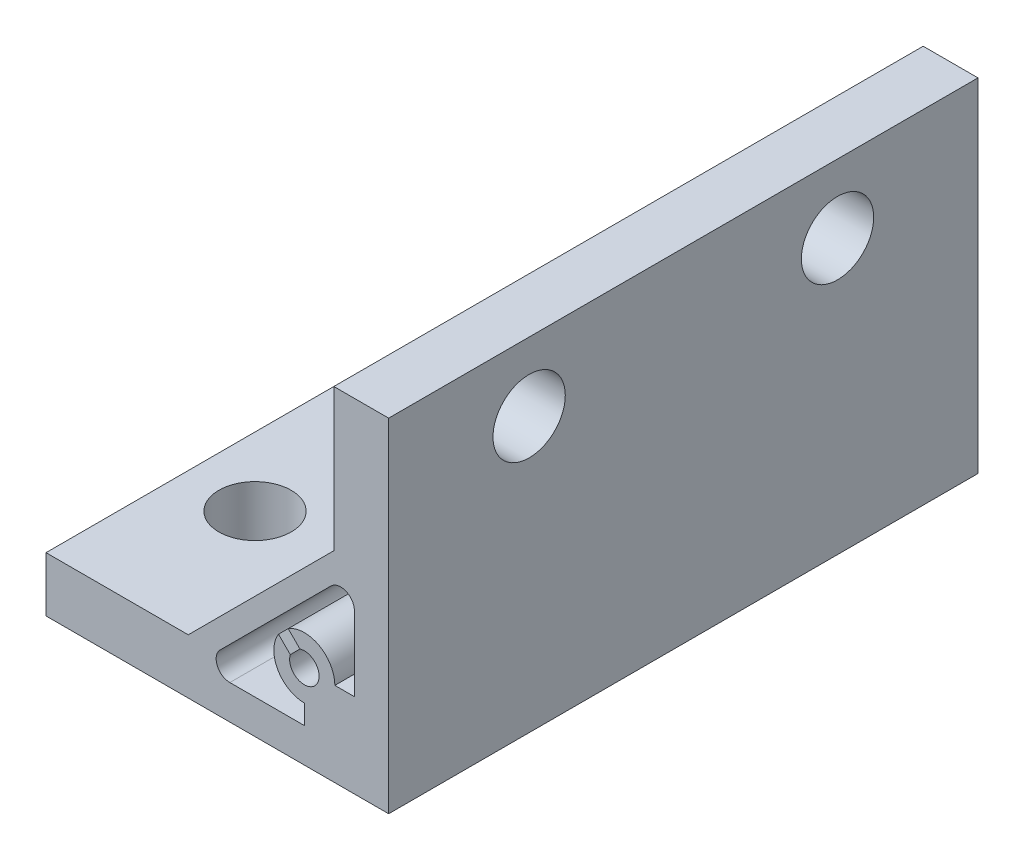
ISO-10303-21;
HEADER;
FILE_DESCRIPTION(('STEP AP214'),'2;1');
FILE_NAME('part.step','',(''),(''),'','','');
FILE_SCHEMA(('AUTOMOTIVE_DESIGN { 1 0 10303 214 1 1 1 1 }'));
ENDSEC;
DATA;
#1=APPLICATION_CONTEXT('core data for automotive mechanical design processes');
#2=APPLICATION_PROTOCOL_DEFINITION('international standard','automotive_design',2000,#1);
#3=PRODUCT_CONTEXT('',#1,'mechanical');
#4=PRODUCT('Part','Part','',(#3));
#5=PRODUCT_RELATED_PRODUCT_CATEGORY('part','',(#4));
#6=PRODUCT_DEFINITION_FORMATION('','',#4);
#7=PRODUCT_DEFINITION_CONTEXT('part definition',#1,'design');
#8=PRODUCT_DEFINITION('design','',#6,#7);
#9=PRODUCT_DEFINITION_SHAPE('','',#8);
#10=(LENGTH_UNIT() NAMED_UNIT(*) SI_UNIT(.MILLI.,.METRE.));
#11=(NAMED_UNIT(*) PLANE_ANGLE_UNIT() SI_UNIT($,.RADIAN.));
#12=(NAMED_UNIT(*) SI_UNIT($,.STERADIAN.) SOLID_ANGLE_UNIT());
#13=UNCERTAINTY_MEASURE_WITH_UNIT(LENGTH_MEASURE(1.E-05),#10,'distance_accuracy_value','');
#14=(GEOMETRIC_REPRESENTATION_CONTEXT(3) GLOBAL_UNCERTAINTY_ASSIGNED_CONTEXT((#13)) GLOBAL_UNIT_ASSIGNED_CONTEXT((#10,
#11,#12)) REPRESENTATION_CONTEXT('',''));
#15=CARTESIAN_POINT('',(0.,0.,0.));
#16=DIRECTION('',(0.,0.,1.));
#17=DIRECTION('',(1.,0.,0.));
#18=AXIS2_PLACEMENT_3D('',#15,#16,#17);
#19=CARTESIAN_POINT('',(50.,0.,43.));
#20=DIRECTION('',(-1.,0.,0.));
#21=DIRECTION('',(0.,0.,1.));
#22=AXIS2_PLACEMENT_3D('',#19,#20,#21);
#23=PLANE('',#22);
#24=CARTESIAN_POINT('',(50.0000000000001,40.,-22.5));
#25=DIRECTION('',(1.,0.,0.));
#26=DIRECTION('',(0.,0.,1.));
#27=AXIS2_PLACEMENT_3D('',#24,#25,#26);
#28=CIRCLE('',#27,5.27668437795866);
#29=CARTESIAN_POINT('',(50.0000000000001,40.,-17.2233156220413));
#30=VERTEX_POINT('',#29);
#31=EDGE_CURVE('E380',#30,#30,#28,.T.);
#32=ORIENTED_EDGE('',*,*,#31,.F.);
#33=EDGE_LOOP('',(#32));
#34=FACE_BOUND('',#33,.T.);
#35=DIRECTION('',(0.,1.,0.));
#36=VECTOR('',#35,1.);
#37=CARTESIAN_POINT('',(50.,0.,-43.));
#38=LINE('',#37,#36);
#39=CARTESIAN_POINT('',(50.,0.,-43.));
#40=VERTEX_POINT('',#39);
#41=CARTESIAN_POINT('',(50.,50.,-43.));
#42=VERTEX_POINT('',#41);
#43=EDGE_CURVE('E283',#40,#42,#38,.T.);
#44=ORIENTED_EDGE('',*,*,#43,.T.);
#45=DIRECTION('',(0.,0.,-1.));
#46=VECTOR('',#45,1.);
#47=CARTESIAN_POINT('',(50.,50.,43.));
#48=LINE('',#47,#46);
#49=CARTESIAN_POINT('',(50.,50.,43.));
#50=VERTEX_POINT('',#49);
#51=EDGE_CURVE('E303',#50,#42,#48,.T.);
#52=ORIENTED_EDGE('',*,*,#51,.F.);
#53=DIRECTION('',(0.,1.,0.));
#54=VECTOR('',#53,1.);
#55=CARTESIAN_POINT('',(50.,0.,43.));
#56=LINE('',#55,#54);
#57=CARTESIAN_POINT('',(50.,0.,43.));
#58=VERTEX_POINT('',#57);
#59=EDGE_CURVE('E268',#58,#50,#56,.T.);
#60=ORIENTED_EDGE('',*,*,#59,.F.);
#61=DIRECTION('',(0.,0.,-1.));
#62=VECTOR('',#61,1.);
#63=CARTESIAN_POINT('',(50.,0.,43.));
#64=LINE('',#63,#62);
#65=EDGE_CURVE('E43',#58,#40,#64,.T.);
#66=ORIENTED_EDGE('',*,*,#65,.T.);
#67=EDGE_LOOP('',(#44,#52,#60,#66));
#68=FACE_BOUND('',#67,.T.);
#69=CARTESIAN_POINT('',(50.0000000000001,40.,22.5));
#70=DIRECTION('',(1.,0.,0.));
#71=DIRECTION('',(0.,0.,-1.));
#72=AXIS2_PLACEMENT_3D('',#69,#70,#71);
#73=CIRCLE('',#72,5.27668437795866);
#74=CARTESIAN_POINT('',(50.0000000000001,40.,17.2233156220413));
#75=VERTEX_POINT('',#74);
#76=EDGE_CURVE('E385',#75,#75,#73,.T.);
#77=ORIENTED_EDGE('',*,*,#76,.F.);
#78=EDGE_LOOP('',(#77));
#79=FACE_BOUND('',#78,.T.);
#80=ADVANCED_FACE('F35',(#34,#68,#79),#23,.F.);
#81=CARTESIAN_POINT('',(42.,29.2426406871192,43.));
#82=DIRECTION('',(1.,0.,0.));
#83=DIRECTION('',(0.,0.,-1.));
#84=AXIS2_PLACEMENT_3D('',#81,#82,#83);
#85=PLANE('',#84);
#86=CARTESIAN_POINT('',(42.0000000000001,40.,-22.5));
#87=DIRECTION('',(1.,0.,0.));
#88=DIRECTION('',(0.,0.,1.));
#89=AXIS2_PLACEMENT_3D('',#86,#87,#88);
#90=CIRCLE('',#89,5.27668437795866);
#91=CARTESIAN_POINT('',(42.0000000000001,40.,-17.2233156220413));
#92=VERTEX_POINT('',#91);
#93=EDGE_CURVE('E382',#92,#92,#90,.T.);
#94=ORIENTED_EDGE('',*,*,#93,.T.);
#95=EDGE_LOOP('',(#94));
#96=FACE_BOUND('',#95,.T.);
#97=DIRECTION('',(0.,-1.,0.));
#98=VECTOR('',#97,1.);
#99=CARTESIAN_POINT('',(42.,29.2426406871192,-43.));
#100=LINE('',#99,#98);
#101=CARTESIAN_POINT('',(42.,50.,-43.));
#102=VERTEX_POINT('',#101);
#103=CARTESIAN_POINT('',(42.,29.2426406871192,-43.));
#104=VERTEX_POINT('',#103);
#105=EDGE_CURVE('E287',#102,#104,#100,.T.);
#106=ORIENTED_EDGE('',*,*,#105,.T.);
#107=DIRECTION('',(0.,0.,-1.));
#108=VECTOR('',#107,1.);
#109=CARTESIAN_POINT('',(42.,29.2426406871192,43.));
#110=LINE('',#109,#108);
#111=CARTESIAN_POINT('',(42.,29.2426406871192,43.));
#112=VERTEX_POINT('',#111);
#113=EDGE_CURVE('E297',#112,#104,#110,.T.);
#114=ORIENTED_EDGE('',*,*,#113,.F.);
#115=DIRECTION('',(0.,-1.,0.));
#116=VECTOR('',#115,1.);
#117=CARTESIAN_POINT('',(42.,29.2426406871192,43.));
#118=LINE('',#117,#116);
#119=CARTESIAN_POINT('',(42.,50.,43.));
#120=VERTEX_POINT('',#119);
#121=EDGE_CURVE('E272',#120,#112,#118,.T.);
#122=ORIENTED_EDGE('',*,*,#121,.F.);
#123=DIRECTION('',(0.,0.,-1.));
#124=VECTOR('',#123,1.);
#125=CARTESIAN_POINT('',(42.,50.,43.));
#126=LINE('',#125,#124);
#127=EDGE_CURVE('E300',#120,#102,#126,.T.);
#128=ORIENTED_EDGE('',*,*,#127,.T.);
#129=EDGE_LOOP('',(#106,#114,#122,#128));
#130=FACE_BOUND('',#129,.T.);
#131=CARTESIAN_POINT('',(42.0000000000001,40.,22.5));
#132=DIRECTION('',(1.,0.,0.));
#133=DIRECTION('',(0.,0.,-1.));
#134=AXIS2_PLACEMENT_3D('',#131,#132,#133);
#135=CIRCLE('',#134,5.27668437795866);
#136=CARTESIAN_POINT('',(42.0000000000001,40.,17.2233156220413));
#137=VERTEX_POINT('',#136);
#138=EDGE_CURVE('E388',#137,#137,#135,.T.);
#139=ORIENTED_EDGE('',*,*,#138,.T.);
#140=EDGE_LOOP('',(#139));
#141=FACE_BOUND('',#140,.T.);
#142=ADVANCED_FACE('F326',(#96,#130,#141),#85,.F.);
#143=CARTESIAN_POINT('',(0.,0.,43.));
#144=DIRECTION('',(0.,0.,1.));
#145=DIRECTION('',(1.,0.,0.));
#146=AXIS2_PLACEMENT_3D('',#143,#144,#145);
#147=PLANE('',#146);
#148=DIRECTION('',(0.,-1.,0.));
#149=VECTOR('',#148,1.);
#150=CARTESIAN_POINT('',(0.,8.,43.));
#151=LINE('',#150,#149);
#152=CARTESIAN_POINT('',(0.,8.,43.));
#153=VERTEX_POINT('',#152);
#154=CARTESIAN_POINT('',(0.,0.,43.));
#155=VERTEX_POINT('',#154);
#156=EDGE_CURVE('E262',#153,#155,#151,.T.);
#157=ORIENTED_EDGE('',*,*,#156,.T.);
#158=DIRECTION('',(1.,0.,0.));
#159=VECTOR('',#158,1.);
#160=CARTESIAN_POINT('',(0.,0.,43.));
#161=LINE('',#160,#159);
#162=EDGE_CURVE('E265',#155,#58,#161,.T.);
#163=ORIENTED_EDGE('',*,*,#162,.T.);
#164=ORIENTED_EDGE('',*,*,#59,.T.);
#165=DIRECTION('',(-1.,0.,0.));
#166=VECTOR('',#165,1.);
#167=CARTESIAN_POINT('',(42.,50.,43.));
#168=LINE('',#167,#166);
#169=EDGE_CURVE('E270',#50,#120,#168,.T.);
#170=ORIENTED_EDGE('',*,*,#169,.T.);
#171=ORIENTED_EDGE('',*,*,#121,.T.);
#172=DIRECTION('',(-0.707106781186546,-0.707106781186549,0.));
#173=VECTOR('',#172,1.);
#174=CARTESIAN_POINT('',(20.7573593128809,8.,43.));
#175=LINE('',#174,#173);
#176=CARTESIAN_POINT('',(20.7573593128809,8.,43.));
#177=VERTEX_POINT('',#176);
#178=EDGE_CURVE('E274',#112,#177,#175,.T.);
#179=ORIENTED_EDGE('',*,*,#178,.T.);
#180=DIRECTION('',(-1.,0.,0.));
#181=VECTOR('',#180,1.);
#182=CARTESIAN_POINT('',(0.,8.,43.));
#183=LINE('',#182,#181);
#184=EDGE_CURVE('E276',#177,#153,#183,.T.);
#185=ORIENTED_EDGE('',*,*,#184,.T.);
#186=EDGE_LOOP('',(#157,#163,#164,#170,#171,#179,#185));
#187=FACE_BOUND('',#186,.T.);
#188=DIRECTION('',(0.707106781186549,-0.707106781186546,0.));
#189=VECTOR('',#188,1.);
#190=CARTESIAN_POINT('',(35.647066335444,12.9387201021829,43.));
#191=LINE('',#190,#189);
#192=CARTESIAN_POINT('',(33.9267474297161,14.6590390079109,43.));
#193=VERTEX_POINT('',#192);
#194=CARTESIAN_POINT('',(35.647066335444,12.9387201021829,43.));
#195=VERTEX_POINT('',#194);
#196=EDGE_CURVE('E174',#193,#195,#191,.T.);
#197=ORIENTED_EDGE('',*,*,#196,.F.);
#198=CARTESIAN_POINT('',(37.7,12.3,43.));
#199=DIRECTION('',(0.,0.,-1.));
#200=DIRECTION('',(1.,0.,0.));
#201=AXIS2_PLACEMENT_3D('',#198,#199,#200);
#202=CIRCLE('',#201,4.45);
#203=CARTESIAN_POINT('',(37.7,7.84999999999995,43.));
#204=VERTEX_POINT('',#203);
#205=EDGE_CURVE('E166',#204,#193,#202,.T.);
#206=ORIENTED_EDGE('',*,*,#205,.F.);
#207=DIRECTION('',(0.,1.,0.));
#208=VECTOR('',#207,1.);
#209=CARTESIAN_POINT('',(37.7,5.,43.));
#210=LINE('',#209,#208);
#211=CARTESIAN_POINT('',(37.7,5.,43.));
#212=VERTEX_POINT('',#211);
#213=EDGE_CURVE('E209',#212,#204,#210,.T.);
#214=ORIENTED_EDGE('',*,*,#213,.F.);
#215=DIRECTION('',(1.,0.,0.));
#216=VECTOR('',#215,1.);
#217=CARTESIAN_POINT('',(26.828427124746,5.,43.));
#218=LINE('',#217,#216);
#219=CARTESIAN_POINT('',(26.828427124746,4.99999999999993,43.));
#220=VERTEX_POINT('',#219);
#221=EDGE_CURVE('E207',#220,#212,#218,.T.);
#222=ORIENTED_EDGE('',*,*,#221,.F.);
#223=CARTESIAN_POINT('',(26.8284271247464,7.00000000000011,43.));
#224=DIRECTION('',(0.,0.,1.));
#225=DIRECTION('',(1.,0.,0.));
#226=AXIS2_PLACEMENT_3D('',#223,#224,#225);
#227=CIRCLE('',#226,2.00000000000019);
#228=CARTESIAN_POINT('',(25.4142135623729,8.41421356237311,43.));
#229=VERTEX_POINT('',#228);
#230=EDGE_CURVE('E205',#229,#220,#227,.T.);
#231=ORIENTED_EDGE('',*,*,#230,.F.);
#232=DIRECTION('',(-0.70710678118655,-0.707106781186545,0.));
#233=VECTOR('',#232,1.);
#234=CARTESIAN_POINT('',(25.4142135623729,8.41421356237311,43.));
#235=LINE('',#234,#233);
#236=CARTESIAN_POINT('',(41.585786437627,24.5857864376269,43.));
#237=VERTEX_POINT('',#236);
#238=EDGE_CURVE('E203',#237,#229,#235,.T.);
#239=ORIENTED_EDGE('',*,*,#238,.F.);
#240=CARTESIAN_POINT('',(43.0000000000002,23.171572875254,43.));
#241=DIRECTION('',(0.,0.,1.));
#242=DIRECTION('',(1.,0.,0.));
#243=AXIS2_PLACEMENT_3D('',#240,#241,#242);
#244=CIRCLE('',#243,1.99999999999993);
#245=CARTESIAN_POINT('',(45.,23.1715728752539,43.));
#246=VERTEX_POINT('',#245);
#247=EDGE_CURVE('E201',#246,#237,#244,.T.);
#248=ORIENTED_EDGE('',*,*,#247,.F.);
#249=DIRECTION('',(0.,1.,0.));
#250=VECTOR('',#249,1.);
#251=CARTESIAN_POINT('',(45.,23.1715728752539,43.));
#252=LINE('',#251,#250);
#253=CARTESIAN_POINT('',(45.,12.3,43.));
#254=VERTEX_POINT('',#253);
#255=EDGE_CURVE('E199',#254,#246,#252,.T.);
#256=ORIENTED_EDGE('',*,*,#255,.F.);
#257=DIRECTION('',(1.,0.,0.));
#258=VECTOR('',#257,1.);
#259=CARTESIAN_POINT('',(42.15,12.3,43.));
#260=LINE('',#259,#258);
#261=CARTESIAN_POINT('',(42.15,12.3,43.));
#262=VERTEX_POINT('',#261);
#263=EDGE_CURVE('E197',#262,#254,#260,.T.);
#264=ORIENTED_EDGE('',*,*,#263,.F.);
#265=CARTESIAN_POINT('',(37.7,12.3,43.));
#266=DIRECTION('',(0.,0.,-1.));
#267=DIRECTION('',(1.,0.,0.));
#268=AXIS2_PLACEMENT_3D('',#265,#266,#267);
#269=CIRCLE('',#268,4.45);
#270=CARTESIAN_POINT('',(35.3409609920885,16.0732525702836,43.));
#271=VERTEX_POINT('',#270);
#272=EDGE_CURVE('E195',#271,#262,#269,.T.);
#273=ORIENTED_EDGE('',*,*,#272,.F.);
#274=DIRECTION('',(-0.707106781186684,0.707106781186411,0.));
#275=VECTOR('',#274,1.);
#276=CARTESIAN_POINT('',(37.0612798978168,14.3529336645559,43.));
#277=LINE('',#276,#275);
#278=CARTESIAN_POINT('',(37.0612798978168,14.3529336645559,43.));
#279=VERTEX_POINT('',#278);
#280=EDGE_CURVE('E190',#279,#271,#277,.T.);
#281=ORIENTED_EDGE('',*,*,#280,.F.);
#282=CARTESIAN_POINT('',(37.7,12.3,43.));
#283=DIRECTION('',(0.,0.,1.));
#284=DIRECTION('',(1.,0.,0.));
#285=AXIS2_PLACEMENT_3D('',#282,#283,#284);
#286=CIRCLE('',#285,2.15);
#287=EDGE_CURVE('E188',#195,#279,#286,.T.);
#288=ORIENTED_EDGE('',*,*,#287,.F.);
#289=EDGE_LOOP('',(#197,#206,#214,#222,#231,#239,#248,#256,#264,#273,#281,#288));
#290=FACE_BOUND('',#289,.T.);
#291=ADVANCED_FACE('F186',(#187,#290),#147,.T.);
#292=CARTESIAN_POINT('',(0.,0.,-43.));
#293=DIRECTION('',(0.,0.,1.));
#294=DIRECTION('',(1.,0.,0.));
#295=AXIS2_PLACEMENT_3D('',#292,#293,#294);
#296=PLANE('',#295);
#297=DIRECTION('',(0.,-1.,0.));
#298=VECTOR('',#297,1.);
#299=CARTESIAN_POINT('',(0.,8.,-43.));
#300=LINE('',#299,#298);
#301=CARTESIAN_POINT('',(0.,8.,-43.));
#302=VERTEX_POINT('',#301);
#303=CARTESIAN_POINT('',(0.,0.,-43.));
#304=VERTEX_POINT('',#303);
#305=EDGE_CURVE('E182',#302,#304,#300,.T.);
#306=ORIENTED_EDGE('',*,*,#305,.F.);
#307=DIRECTION('',(-1.,0.,0.));
#308=VECTOR('',#307,1.);
#309=CARTESIAN_POINT('',(0.,8.,-43.));
#310=LINE('',#309,#308);
#311=CARTESIAN_POINT('',(20.7573593128809,8.,-43.));
#312=VERTEX_POINT('',#311);
#313=EDGE_CURVE('E266',#312,#302,#310,.T.);
#314=ORIENTED_EDGE('',*,*,#313,.F.);
#315=DIRECTION('',(-0.707106781186546,-0.707106781186549,0.));
#316=VECTOR('',#315,1.);
#317=CARTESIAN_POINT('',(20.7573593128809,8.,-43.));
#318=LINE('',#317,#316);
#319=EDGE_CURVE('E289',#104,#312,#318,.T.);
#320=ORIENTED_EDGE('',*,*,#319,.F.);
#321=ORIENTED_EDGE('',*,*,#105,.F.);
#322=DIRECTION('',(-1.,0.,0.));
#323=VECTOR('',#322,1.);
#324=CARTESIAN_POINT('',(42.,50.,-43.));
#325=LINE('',#324,#323);
#326=EDGE_CURVE('E285',#42,#102,#325,.T.);
#327=ORIENTED_EDGE('',*,*,#326,.F.);
#328=ORIENTED_EDGE('',*,*,#43,.F.);
#329=DIRECTION('',(1.,0.,0.));
#330=VECTOR('',#329,1.);
#331=CARTESIAN_POINT('',(0.,0.,-43.));
#332=LINE('',#331,#330);
#333=EDGE_CURVE('E281',#304,#40,#332,.T.);
#334=ORIENTED_EDGE('',*,*,#333,.F.);
#335=EDGE_LOOP('',(#306,#314,#320,#321,#327,#328,#334));
#336=FACE_BOUND('',#335,.T.);
#337=CARTESIAN_POINT('',(37.7,12.3,-43.));
#338=DIRECTION('',(0.,0.,-1.));
#339=DIRECTION('',(1.,0.,0.));
#340=AXIS2_PLACEMENT_3D('',#337,#338,#339);
#341=CIRCLE('',#340,4.45);
#342=CARTESIAN_POINT('',(37.7,7.84999999999995,-43.));
#343=VERTEX_POINT('',#342);
#344=CARTESIAN_POINT('',(33.9267474297161,14.6590390079109,-43.));
#345=VERTEX_POINT('',#344);
#346=EDGE_CURVE('E58',#343,#345,#341,.T.);
#347=ORIENTED_EDGE('',*,*,#346,.T.);
#348=DIRECTION('',(0.707106781186549,-0.707106781186546,0.));
#349=VECTOR('',#348,1.);
#350=CARTESIAN_POINT('',(35.647066335444,12.9387201021829,-43.));
#351=LINE('',#350,#349);
#352=CARTESIAN_POINT('',(35.647066335444,12.9387201021829,-43.));
#353=VERTEX_POINT('',#352);
#354=EDGE_CURVE('E181',#345,#353,#351,.T.);
#355=ORIENTED_EDGE('',*,*,#354,.T.);
#356=CARTESIAN_POINT('',(37.7,12.3,-43.));
#357=DIRECTION('',(0.,0.,1.));
#358=DIRECTION('',(1.,0.,0.));
#359=AXIS2_PLACEMENT_3D('',#356,#357,#358);
#360=CIRCLE('',#359,2.15);
#361=CARTESIAN_POINT('',(37.0612798978168,14.3529336645559,-43.));
#362=VERTEX_POINT('',#361);
#363=EDGE_CURVE('E214',#353,#362,#360,.T.);
#364=ORIENTED_EDGE('',*,*,#363,.T.);
#365=DIRECTION('',(-0.707106781186684,0.707106781186411,0.));
#366=VECTOR('',#365,1.);
#367=CARTESIAN_POINT('',(37.0612798978168,14.3529336645559,-43.));
#368=LINE('',#367,#366);
#369=CARTESIAN_POINT('',(35.3409609920885,16.0732525702836,-43.));
#370=VERTEX_POINT('',#369);
#371=EDGE_CURVE('E217',#362,#370,#368,.T.);
#372=ORIENTED_EDGE('',*,*,#371,.T.);
#373=CARTESIAN_POINT('',(37.7,12.3,-43.));
#374=DIRECTION('',(0.,0.,-1.));
#375=DIRECTION('',(1.,0.,0.));
#376=AXIS2_PLACEMENT_3D('',#373,#374,#375);
#377=CIRCLE('',#376,4.45);
#378=CARTESIAN_POINT('',(42.15,12.3,-43.));
#379=VERTEX_POINT('',#378);
#380=EDGE_CURVE('E220',#370,#379,#377,.T.);
#381=ORIENTED_EDGE('',*,*,#380,.T.);
#382=DIRECTION('',(1.,0.,0.));
#383=VECTOR('',#382,1.);
#384=CARTESIAN_POINT('',(42.15,12.3,-43.));
#385=LINE('',#384,#383);
#386=CARTESIAN_POINT('',(45.,12.3,-43.));
#387=VERTEX_POINT('',#386);
#388=EDGE_CURVE('E223',#379,#387,#385,.T.);
#389=ORIENTED_EDGE('',*,*,#388,.T.);
#390=DIRECTION('',(0.,1.,0.));
#391=VECTOR('',#390,1.);
#392=CARTESIAN_POINT('',(45.,23.1715728752539,-43.));
#393=LINE('',#392,#391);
#394=CARTESIAN_POINT('',(45.,23.1715728752539,-43.));
#395=VERTEX_POINT('',#394);
#396=EDGE_CURVE('E226',#387,#395,#393,.T.);
#397=ORIENTED_EDGE('',*,*,#396,.T.);
#398=CARTESIAN_POINT('',(43.0000000000002,23.171572875254,-43.));
#399=DIRECTION('',(0.,0.,1.));
#400=DIRECTION('',(1.,0.,0.));
#401=AXIS2_PLACEMENT_3D('',#398,#399,#400);
#402=CIRCLE('',#401,1.99999999999993);
#403=CARTESIAN_POINT('',(41.585786437627,24.5857864376269,-43.));
#404=VERTEX_POINT('',#403);
#405=EDGE_CURVE('E229',#395,#404,#402,.T.);
#406=ORIENTED_EDGE('',*,*,#405,.T.);
#407=DIRECTION('',(-0.70710678118655,-0.707106781186545,0.));
#408=VECTOR('',#407,1.);
#409=CARTESIAN_POINT('',(25.4142135623729,8.41421356237311,-43.));
#410=LINE('',#409,#408);
#411=CARTESIAN_POINT('',(25.4142135623729,8.41421356237311,-43.));
#412=VERTEX_POINT('',#411);
#413=EDGE_CURVE('E232',#404,#412,#410,.T.);
#414=ORIENTED_EDGE('',*,*,#413,.T.);
#415=CARTESIAN_POINT('',(26.8284271247464,7.00000000000011,-43.));
#416=DIRECTION('',(0.,0.,1.));
#417=DIRECTION('',(1.,0.,0.));
#418=AXIS2_PLACEMENT_3D('',#415,#416,#417);
#419=CIRCLE('',#418,2.00000000000019);
#420=CARTESIAN_POINT('',(26.828427124746,4.99999999999993,-43.));
#421=VERTEX_POINT('',#420);
#422=EDGE_CURVE('E235',#412,#421,#419,.T.);
#423=ORIENTED_EDGE('',*,*,#422,.T.);
#424=DIRECTION('',(1.,0.,0.));
#425=VECTOR('',#424,1.);
#426=CARTESIAN_POINT('',(26.828427124746,5.,-43.));
#427=LINE('',#426,#425);
#428=CARTESIAN_POINT('',(37.7,5.,-43.));
#429=VERTEX_POINT('',#428);
#430=EDGE_CURVE('E238',#421,#429,#427,.T.);
#431=ORIENTED_EDGE('',*,*,#430,.T.);
#432=DIRECTION('',(0.,1.,0.));
#433=VECTOR('',#432,1.);
#434=CARTESIAN_POINT('',(37.7,5.,-43.));
#435=LINE('',#434,#433);
#436=EDGE_CURVE('E175',#429,#343,#435,.T.);
#437=ORIENTED_EDGE('',*,*,#436,.T.);
#438=EDGE_LOOP('',(#347,#355,#364,#372,#381,#389,#397,#406,#414,#423,#431,#437));
#439=FACE_BOUND('',#438,.T.);
#440=ADVANCED_FACE('F316',(#336,#439),#296,.F.);
#441=CARTESIAN_POINT('',(0.,8.,43.));
#442=DIRECTION('',(1.,0.,0.));
#443=DIRECTION('',(0.,0.,-1.));
#444=AXIS2_PLACEMENT_3D('',#441,#442,#443);
#445=PLANE('',#444);
#446=ORIENTED_EDGE('',*,*,#305,.T.);
#447=DIRECTION('',(0.,0.,-1.));
#448=VECTOR('',#447,1.);
#449=CARTESIAN_POINT('',(0.,0.,43.));
#450=LINE('',#449,#448);
#451=EDGE_CURVE('E11',#155,#304,#450,.T.);
#452=ORIENTED_EDGE('',*,*,#451,.F.);
#453=ORIENTED_EDGE('',*,*,#156,.F.);
#454=DIRECTION('',(0.,0.,-1.));
#455=VECTOR('',#454,1.);
#456=CARTESIAN_POINT('',(0.,8.,43.));
#457=LINE('',#456,#455);
#458=EDGE_CURVE('E278',#153,#302,#457,.T.);
#459=ORIENTED_EDGE('',*,*,#458,.T.);
#460=EDGE_LOOP('',(#446,#452,#453,#459));
#461=FACE_BOUND('',#460,.T.);
#462=ADVANCED_FACE('F37',(#461),#445,.F.);
#463=CARTESIAN_POINT('',(0.,0.,43.));
#464=DIRECTION('',(0.,1.,0.));
#465=DIRECTION('',(0.,0.,1.));
#466=AXIS2_PLACEMENT_3D('',#463,#464,#465);
#467=PLANE('',#466);
#468=CARTESIAN_POINT('',(10.,0.,22.5));
#469=DIRECTION('',(0.,1.,0.));
#470=DIRECTION('',(0.,0.,-1.));
#471=AXIS2_PLACEMENT_3D('',#468,#469,#470);
#472=CIRCLE('',#471,5.27668437795866);
#473=CARTESIAN_POINT('',(10.,0.,17.2233156220413));
#474=VERTEX_POINT('',#473);
#475=EDGE_CURVE('E369',#474,#474,#472,.T.);
#476=ORIENTED_EDGE('',*,*,#475,.T.);
#477=EDGE_LOOP('',(#476));
#478=FACE_BOUND('',#477,.T.);
#479=CARTESIAN_POINT('',(10.,0.,-22.5));
#480=DIRECTION('',(0.,1.,0.));
#481=DIRECTION('',(0.,0.,1.));
#482=AXIS2_PLACEMENT_3D('',#479,#480,#481);
#483=CIRCLE('',#482,5.27668437795866);
#484=CARTESIAN_POINT('',(10.,0.,-17.2233156220413));
#485=VERTEX_POINT('',#484);
#486=EDGE_CURVE('E212',#485,#485,#483,.T.);
#487=ORIENTED_EDGE('',*,*,#486,.T.);
#488=EDGE_LOOP('',(#487));
#489=FACE_BOUND('',#488,.T.);
#490=ORIENTED_EDGE('',*,*,#333,.T.);
#491=ORIENTED_EDGE('',*,*,#65,.F.);
#492=ORIENTED_EDGE('',*,*,#162,.F.);
#493=ORIENTED_EDGE('',*,*,#451,.T.);
#494=EDGE_LOOP('',(#490,#491,#492,#493));
#495=FACE_BOUND('',#494,.T.);
#496=ADVANCED_FACE('F334',(#478,#489,#495),#467,.F.);
#497=CARTESIAN_POINT('',(42.,50.,43.));
#498=DIRECTION('',(0.,-1.,0.));
#499=DIRECTION('',(0.,0.,-1.));
#500=AXIS2_PLACEMENT_3D('',#497,#498,#499);
#501=PLANE('',#500);
#502=ORIENTED_EDGE('',*,*,#326,.T.);
#503=ORIENTED_EDGE('',*,*,#127,.F.);
#504=ORIENTED_EDGE('',*,*,#169,.F.);
#505=ORIENTED_EDGE('',*,*,#51,.T.);
#506=EDGE_LOOP('',(#502,#503,#504,#505));
#507=FACE_BOUND('',#506,.T.);
#508=ADVANCED_FACE('F322',(#507),#501,.F.);
#509=CARTESIAN_POINT('',(20.7573593128809,8.,43.));
#510=DIRECTION('',(0.707106781186549,-0.707106781186546,0.));
#511=DIRECTION('',(0.707106781186546,0.707106781186549,0.));
#512=AXIS2_PLACEMENT_3D('',#509,#510,#511);
#513=PLANE('',#512);
#514=ORIENTED_EDGE('',*,*,#319,.T.);
#515=DIRECTION('',(0.,0.,-1.));
#516=VECTOR('',#515,1.);
#517=CARTESIAN_POINT('',(20.7573593128809,8.,43.));
#518=LINE('',#517,#516);
#519=EDGE_CURVE('E294',#177,#312,#518,.T.);
#520=ORIENTED_EDGE('',*,*,#519,.F.);
#521=ORIENTED_EDGE('',*,*,#178,.F.);
#522=ORIENTED_EDGE('',*,*,#113,.T.);
#523=EDGE_LOOP('',(#514,#520,#521,#522));
#524=FACE_BOUND('',#523,.T.);
#525=ADVANCED_FACE('F342',(#524),#513,.F.);
#526=CARTESIAN_POINT('',(0.,8.,43.));
#527=DIRECTION('',(0.,-1.,0.));
#528=DIRECTION('',(0.,0.,-1.));
#529=AXIS2_PLACEMENT_3D('',#526,#527,#528);
#530=PLANE('',#529);
#531=CARTESIAN_POINT('',(10.,8.,22.5));
#532=DIRECTION('',(0.,1.,0.));
#533=DIRECTION('',(0.,0.,-1.));
#534=AXIS2_PLACEMENT_3D('',#531,#532,#533);
#535=CIRCLE('',#534,5.27668437795866);
#536=CARTESIAN_POINT('',(10.,8.,17.2233156220413));
#537=VERTEX_POINT('',#536);
#538=EDGE_CURVE('E377',#537,#537,#535,.T.);
#539=ORIENTED_EDGE('',*,*,#538,.F.);
#540=EDGE_LOOP('',(#539));
#541=FACE_BOUND('',#540,.T.);
#542=CARTESIAN_POINT('',(10.,8.,-22.5));
#543=DIRECTION('',(0.,1.,0.));
#544=DIRECTION('',(0.,0.,1.));
#545=AXIS2_PLACEMENT_3D('',#542,#543,#544);
#546=CIRCLE('',#545,5.27668437795866);
#547=CARTESIAN_POINT('',(10.,8.,-17.2233156220413));
#548=VERTEX_POINT('',#547);
#549=EDGE_CURVE('E373',#548,#548,#546,.T.);
#550=ORIENTED_EDGE('',*,*,#549,.F.);
#551=EDGE_LOOP('',(#550));
#552=FACE_BOUND('',#551,.T.);
#553=ORIENTED_EDGE('',*,*,#313,.T.);
#554=ORIENTED_EDGE('',*,*,#458,.F.);
#555=ORIENTED_EDGE('',*,*,#184,.F.);
#556=ORIENTED_EDGE('',*,*,#519,.T.);
#557=EDGE_LOOP('',(#553,#554,#555,#556));
#558=FACE_BOUND('',#557,.T.);
#559=ADVANCED_FACE('F339',(#541,#552,#558),#530,.F.);
#560=CARTESIAN_POINT('',(37.7,12.3,43.));
#561=DIRECTION('',(0.,0.,-1.));
#562=DIRECTION('',(-1.,0.,0.));
#563=AXIS2_PLACEMENT_3D('',#560,#561,#562);
#564=CYLINDRICAL_SURFACE('',#563,4.45);
#565=ORIENTED_EDGE('',*,*,#346,.F.);
#566=DIRECTION('',(0.,0.,-1.));
#567=VECTOR('',#566,1.);
#568=CARTESIAN_POINT('',(37.7,7.84999999999995,43.));
#569=LINE('',#568,#567);
#570=EDGE_CURVE('E170',#204,#343,#569,.T.);
#571=ORIENTED_EDGE('',*,*,#570,.F.);
#572=ORIENTED_EDGE('',*,*,#205,.T.);
#573=DIRECTION('',(0.,0.,-1.));
#574=VECTOR('',#573,1.);
#575=CARTESIAN_POINT('',(33.9267474297161,14.6590390079109,43.));
#576=LINE('',#575,#574);
#577=EDGE_CURVE('E169',#193,#345,#576,.T.);
#578=ORIENTED_EDGE('',*,*,#577,.T.);
#579=EDGE_LOOP('',(#565,#571,#572,#578));
#580=FACE_BOUND('',#579,.T.);
#581=ADVANCED_FACE('F168',(#580),#564,.T.);
#582=CARTESIAN_POINT('',(35.647066335444,12.9387201021829,43.));
#583=DIRECTION('',(0.707106781186546,0.707106781186549,0.));
#584=DIRECTION('',(-0.707106781186549,0.707106781186546,0.));
#585=AXIS2_PLACEMENT_3D('',#582,#583,#584);
#586=PLANE('',#585);
#587=ORIENTED_EDGE('',*,*,#354,.F.);
#588=ORIENTED_EDGE('',*,*,#577,.F.);
#589=ORIENTED_EDGE('',*,*,#196,.T.);
#590=DIRECTION('',(0.,0.,-1.));
#591=VECTOR('',#590,1.);
#592=CARTESIAN_POINT('',(35.647066335444,12.9387201021829,43.));
#593=LINE('',#592,#591);
#594=EDGE_CURVE('E183',#195,#353,#593,.T.);
#595=ORIENTED_EDGE('',*,*,#594,.T.);
#596=EDGE_LOOP('',(#587,#588,#589,#595));
#597=FACE_BOUND('',#596,.T.);
#598=ADVANCED_FACE('F178',(#597),#586,.T.);
#599=CARTESIAN_POINT('',(37.7,12.3,43.));
#600=DIRECTION('',(0.,0.,-1.));
#601=DIRECTION('',(-1.,0.,0.));
#602=AXIS2_PLACEMENT_3D('',#599,#600,#601);
#603=CYLINDRICAL_SURFACE('',#602,2.15);
#604=ORIENTED_EDGE('',*,*,#363,.F.);
#605=ORIENTED_EDGE('',*,*,#594,.F.);
#606=ORIENTED_EDGE('',*,*,#287,.T.);
#607=DIRECTION('',(0.,0.,-1.));
#608=VECTOR('',#607,1.);
#609=CARTESIAN_POINT('',(37.0612798978168,14.3529336645559,43.));
#610=LINE('',#609,#608);
#611=EDGE_CURVE('E259',#279,#362,#610,.T.);
#612=ORIENTED_EDGE('',*,*,#611,.T.);
#613=EDGE_LOOP('',(#604,#605,#606,#612));
#614=FACE_BOUND('',#613,.T.);
#615=ADVANCED_FACE('F447',(#614),#603,.F.);
#616=CARTESIAN_POINT('',(37.0612798978168,14.3529336645559,43.));
#617=DIRECTION('',(-0.707106781186411,-0.707106781186684,0.));
#618=DIRECTION('',(0.707106781186684,-0.707106781186411,0.));
#619=AXIS2_PLACEMENT_3D('',#616,#617,#618);
#620=PLANE('',#619);
#621=ORIENTED_EDGE('',*,*,#371,.F.);
#622=ORIENTED_EDGE('',*,*,#611,.F.);
#623=ORIENTED_EDGE('',*,*,#280,.T.);
#624=DIRECTION('',(0.,0.,-1.));
#625=VECTOR('',#624,1.);
#626=CARTESIAN_POINT('',(35.3409609920885,16.0732525702836,43.));
#627=LINE('',#626,#625);
#628=EDGE_CURVE('E257',#271,#370,#627,.T.);
#629=ORIENTED_EDGE('',*,*,#628,.T.);
#630=EDGE_LOOP('',(#621,#622,#623,#629));
#631=FACE_BOUND('',#630,.T.);
#632=ADVANCED_FACE('F443',(#631),#620,.T.);
#633=CARTESIAN_POINT('',(37.7,12.3,43.));
#634=DIRECTION('',(0.,0.,-1.));
#635=DIRECTION('',(-1.,0.,0.));
#636=AXIS2_PLACEMENT_3D('',#633,#634,#635);
#637=CYLINDRICAL_SURFACE('',#636,4.45);
#638=ORIENTED_EDGE('',*,*,#380,.F.);
#639=ORIENTED_EDGE('',*,*,#628,.F.);
#640=ORIENTED_EDGE('',*,*,#272,.T.);
#641=DIRECTION('',(0.,0.,-1.));
#642=VECTOR('',#641,1.);
#643=CARTESIAN_POINT('',(42.15,12.3,43.));
#644=LINE('',#643,#642);
#645=EDGE_CURVE('E255',#262,#379,#644,.T.);
#646=ORIENTED_EDGE('',*,*,#645,.T.);
#647=EDGE_LOOP('',(#638,#639,#640,#646));
#648=FACE_BOUND('',#647,.T.);
#649=ADVANCED_FACE('F439',(#648),#637,.T.);
#650=CARTESIAN_POINT('',(42.15,12.3,43.));
#651=DIRECTION('',(0.,1.,0.));
#652=DIRECTION('',(0.,0.,1.));
#653=AXIS2_PLACEMENT_3D('',#650,#651,#652);
#654=PLANE('',#653);
#655=ORIENTED_EDGE('',*,*,#388,.F.);
#656=ORIENTED_EDGE('',*,*,#645,.F.);
#657=ORIENTED_EDGE('',*,*,#263,.T.);
#658=DIRECTION('',(0.,0.,-1.));
#659=VECTOR('',#658,1.);
#660=CARTESIAN_POINT('',(45.,12.3,43.));
#661=LINE('',#660,#659);
#662=EDGE_CURVE('E253',#254,#387,#661,.T.);
#663=ORIENTED_EDGE('',*,*,#662,.T.);
#664=EDGE_LOOP('',(#655,#656,#657,#663));
#665=FACE_BOUND('',#664,.T.);
#666=ADVANCED_FACE('F435',(#665),#654,.T.);
#667=CARTESIAN_POINT('',(45.,23.1715728752539,43.));
#668=DIRECTION('',(-1.,0.,0.));
#669=DIRECTION('',(0.,0.,1.));
#670=AXIS2_PLACEMENT_3D('',#667,#668,#669);
#671=PLANE('',#670);
#672=ORIENTED_EDGE('',*,*,#396,.F.);
#673=ORIENTED_EDGE('',*,*,#662,.F.);
#674=ORIENTED_EDGE('',*,*,#255,.T.);
#675=DIRECTION('',(0.,0.,-1.));
#676=VECTOR('',#675,1.);
#677=CARTESIAN_POINT('',(45.,23.1715728752539,43.));
#678=LINE('',#677,#676);
#679=EDGE_CURVE('E251',#246,#395,#678,.T.);
#680=ORIENTED_EDGE('',*,*,#679,.T.);
#681=EDGE_LOOP('',(#672,#673,#674,#680));
#682=FACE_BOUND('',#681,.T.);
#683=ADVANCED_FACE('F431',(#682),#671,.T.);
#684=CARTESIAN_POINT('',(43.0000000000002,23.171572875254,43.));
#685=DIRECTION('',(0.,0.,-1.));
#686=DIRECTION('',(-1.,0.,0.));
#687=AXIS2_PLACEMENT_3D('',#684,#685,#686);
#688=CYLINDRICAL_SURFACE('',#687,1.99999999999993);
#689=ORIENTED_EDGE('',*,*,#405,.F.);
#690=ORIENTED_EDGE('',*,*,#679,.F.);
#691=ORIENTED_EDGE('',*,*,#247,.T.);
#692=DIRECTION('',(0.,0.,-1.));
#693=VECTOR('',#692,1.);
#694=CARTESIAN_POINT('',(41.585786437627,24.5857864376269,43.));
#695=LINE('',#694,#693);
#696=EDGE_CURVE('E249',#237,#404,#695,.T.);
#697=ORIENTED_EDGE('',*,*,#696,.T.);
#698=EDGE_LOOP('',(#689,#690,#691,#697));
#699=FACE_BOUND('',#698,.T.);
#700=ADVANCED_FACE('F427',(#699),#688,.F.);
#701=CARTESIAN_POINT('',(25.4142135623729,8.41421356237311,43.));
#702=DIRECTION('',(0.707106781186545,-0.70710678118655,0.));
#703=DIRECTION('',(0.70710678118655,0.707106781186545,0.));
#704=AXIS2_PLACEMENT_3D('',#701,#702,#703);
#705=PLANE('',#704);
#706=ORIENTED_EDGE('',*,*,#413,.F.);
#707=ORIENTED_EDGE('',*,*,#696,.F.);
#708=ORIENTED_EDGE('',*,*,#238,.T.);
#709=DIRECTION('',(0.,0.,-1.));
#710=VECTOR('',#709,1.);
#711=CARTESIAN_POINT('',(25.4142135623729,8.41421356237311,43.));
#712=LINE('',#711,#710);
#713=EDGE_CURVE('E247',#229,#412,#712,.T.);
#714=ORIENTED_EDGE('',*,*,#713,.T.);
#715=EDGE_LOOP('',(#706,#707,#708,#714));
#716=FACE_BOUND('',#715,.T.);
#717=ADVANCED_FACE('F423',(#716),#705,.T.);
#718=CARTESIAN_POINT('',(26.8284271247464,7.00000000000011,43.));
#719=DIRECTION('',(0.,0.,-1.));
#720=DIRECTION('',(-1.,0.,0.));
#721=AXIS2_PLACEMENT_3D('',#718,#719,#720);
#722=CYLINDRICAL_SURFACE('',#721,2.00000000000019);
#723=ORIENTED_EDGE('',*,*,#422,.F.);
#724=ORIENTED_EDGE('',*,*,#713,.F.);
#725=ORIENTED_EDGE('',*,*,#230,.T.);
#726=DIRECTION('',(0.,0.,-1.));
#727=VECTOR('',#726,1.);
#728=CARTESIAN_POINT('',(26.828427124746,4.99999999999993,43.));
#729=LINE('',#728,#727);
#730=EDGE_CURVE('E245',#220,#421,#729,.T.);
#731=ORIENTED_EDGE('',*,*,#730,.T.);
#732=EDGE_LOOP('',(#723,#724,#725,#731));
#733=FACE_BOUND('',#732,.T.);
#734=ADVANCED_FACE('F419',(#733),#722,.F.);
#735=CARTESIAN_POINT('',(26.828427124746,5.,43.));
#736=DIRECTION('',(0.,1.,0.));
#737=DIRECTION('',(0.,0.,1.));
#738=AXIS2_PLACEMENT_3D('',#735,#736,#737);
#739=PLANE('',#738);
#740=ORIENTED_EDGE('',*,*,#430,.F.);
#741=ORIENTED_EDGE('',*,*,#730,.F.);
#742=ORIENTED_EDGE('',*,*,#221,.T.);
#743=DIRECTION('',(0.,0.,-1.));
#744=VECTOR('',#743,1.);
#745=CARTESIAN_POINT('',(37.7,5.,43.));
#746=LINE('',#745,#744);
#747=EDGE_CURVE('E50',#212,#429,#746,.T.);
#748=ORIENTED_EDGE('',*,*,#747,.T.);
#749=EDGE_LOOP('',(#740,#741,#742,#748));
#750=FACE_BOUND('',#749,.T.);
#751=ADVANCED_FACE('F416',(#750),#739,.T.);
#752=CARTESIAN_POINT('',(37.7,5.,43.));
#753=DIRECTION('',(-1.,0.,0.));
#754=DIRECTION('',(0.,0.,1.));
#755=AXIS2_PLACEMENT_3D('',#752,#753,#754);
#756=PLANE('',#755);
#757=ORIENTED_EDGE('',*,*,#436,.F.);
#758=ORIENTED_EDGE('',*,*,#747,.F.);
#759=ORIENTED_EDGE('',*,*,#213,.T.);
#760=ORIENTED_EDGE('',*,*,#570,.T.);
#761=EDGE_LOOP('',(#757,#758,#759,#760));
#762=FACE_BOUND('',#761,.T.);
#763=ADVANCED_FACE('F413',(#762),#756,.T.);
#764=CARTESIAN_POINT('',(10.,0.,-22.5));
#765=DIRECTION('',(0.,1.,0.));
#766=DIRECTION('',(0.,0.,1.));
#767=AXIS2_PLACEMENT_3D('',#764,#765,#766);
#768=CYLINDRICAL_SURFACE('',#767,5.27668437795866);
#769=ORIENTED_EDGE('',*,*,#486,.F.);
#770=EDGE_LOOP('',(#769));
#771=FACE_BOUND('',#770,.T.);
#772=ORIENTED_EDGE('',*,*,#549,.T.);
#773=EDGE_LOOP('',(#772));
#774=FACE_BOUND('',#773,.T.);
#775=ADVANCED_FACE('F409',(#771,#774),#768,.F.);
#776=CARTESIAN_POINT('',(10.,0.,22.5));
#777=DIRECTION('',(0.,1.,0.));
#778=DIRECTION('',(0.,0.,1.));
#779=AXIS2_PLACEMENT_3D('',#776,#777,#778);
#780=CYLINDRICAL_SURFACE('',#779,5.27668437795866);
#781=ORIENTED_EDGE('',*,*,#475,.F.);
#782=EDGE_LOOP('',(#781));
#783=FACE_BOUND('',#782,.T.);
#784=ORIENTED_EDGE('',*,*,#538,.T.);
#785=EDGE_LOOP('',(#784));
#786=FACE_BOUND('',#785,.T.);
#787=ADVANCED_FACE('F403',(#783,#786),#780,.F.);
#788=CARTESIAN_POINT('',(50.0000000000001,40.,-22.5));
#789=DIRECTION('',(-1.,0.,0.));
#790=DIRECTION('',(0.,-1.,0.));
#791=AXIS2_PLACEMENT_3D('',#788,#789,#790);
#792=CYLINDRICAL_SURFACE('',#791,5.27668437795866);
#793=ORIENTED_EDGE('',*,*,#31,.T.);
#794=EDGE_LOOP('',(#793));
#795=FACE_BOUND('',#794,.T.);
#796=ORIENTED_EDGE('',*,*,#93,.F.);
#797=EDGE_LOOP('',(#796));
#798=FACE_BOUND('',#797,.T.);
#799=ADVANCED_FACE('F397',(#795,#798),#792,.F.);
#800=CARTESIAN_POINT('',(50.0000000000001,40.,22.5));
#801=DIRECTION('',(-1.,0.,0.));
#802=DIRECTION('',(0.,-1.,0.));
#803=AXIS2_PLACEMENT_3D('',#800,#801,#802);
#804=CYLINDRICAL_SURFACE('',#803,5.27668437795866);
#805=ORIENTED_EDGE('',*,*,#76,.T.);
#806=EDGE_LOOP('',(#805));
#807=FACE_BOUND('',#806,.T.);
#808=ORIENTED_EDGE('',*,*,#138,.F.);
#809=EDGE_LOOP('',(#808));
#810=FACE_BOUND('',#809,.T.);
#811=ADVANCED_FACE('F394',(#807,#810),#804,.F.);
#812=CLOSED_SHELL('',(#80,#142,#291,#440,#462,#496,#508,#525,#559,#581,#598,#615,#632,#649,#666,
#683,#700,#717,#734,#751,#763,#775,#787,#799,#811));
#813=MANIFOLD_SOLID_BREP('B2',#812);
#814=ADVANCED_BREP_SHAPE_REPRESENTATION('',(#18,#813),#14);
#815=SHAPE_DEFINITION_REPRESENTATION(#9,#814);
ENDSEC;
END-ISO-10303-21;
